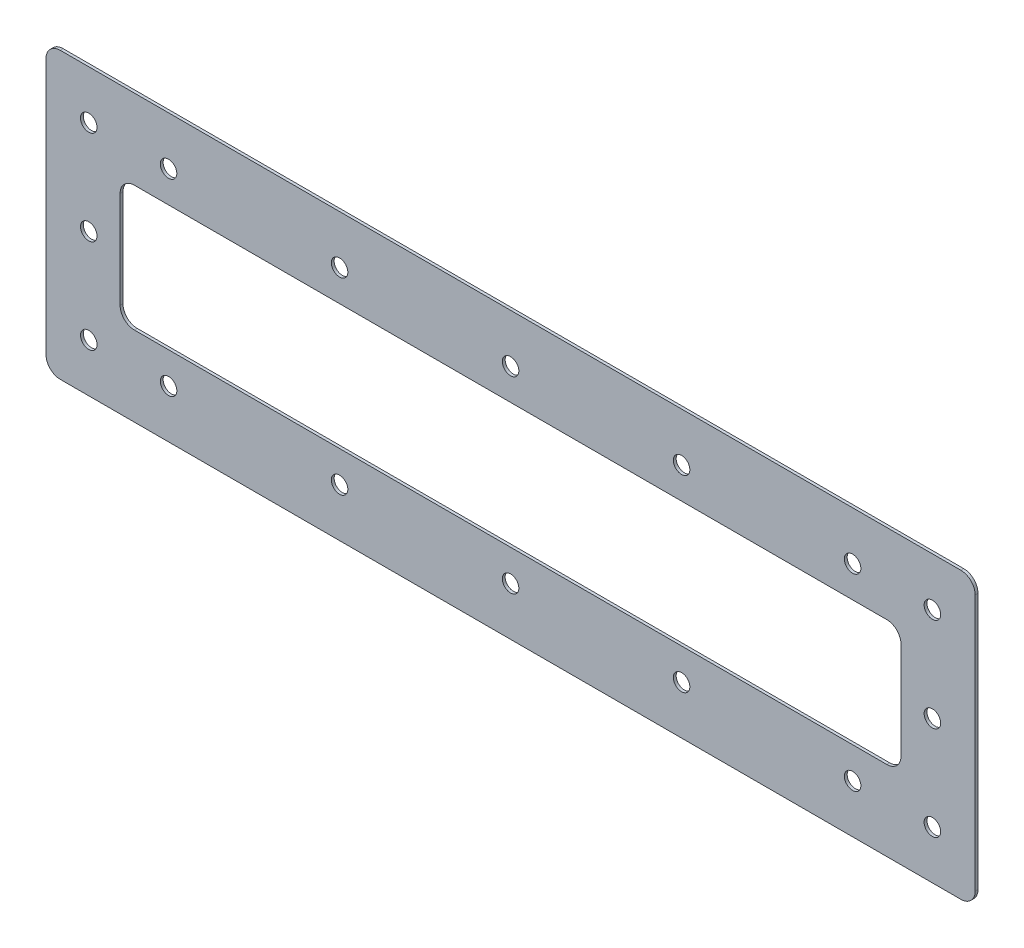
ISO-10303-21;
HEADER;
FILE_DESCRIPTION(('STEP AP214'),'2;1');
FILE_NAME('part.step','',(''),(''),'','','');
FILE_SCHEMA(('AUTOMOTIVE_DESIGN { 1 0 10303 214 1 1 1 1 }'));
ENDSEC;
DATA;
#1=APPLICATION_CONTEXT('core data for automotive mechanical design processes');
#2=APPLICATION_PROTOCOL_DEFINITION('international standard','automotive_design',2000,#1);
#3=PRODUCT_CONTEXT('',#1,'mechanical');
#4=PRODUCT('Part','Part','',(#3));
#5=PRODUCT_RELATED_PRODUCT_CATEGORY('part','',(#4));
#6=PRODUCT_DEFINITION_FORMATION('','',#4);
#7=PRODUCT_DEFINITION_CONTEXT('part definition',#1,'design');
#8=PRODUCT_DEFINITION('design','',#6,#7);
#9=PRODUCT_DEFINITION_SHAPE('','',#8);
#10=(LENGTH_UNIT() NAMED_UNIT(*) SI_UNIT(.MILLI.,.METRE.));
#11=(NAMED_UNIT(*) PLANE_ANGLE_UNIT() SI_UNIT($,.RADIAN.));
#12=(NAMED_UNIT(*) SI_UNIT($,.STERADIAN.) SOLID_ANGLE_UNIT());
#13=UNCERTAINTY_MEASURE_WITH_UNIT(LENGTH_MEASURE(1.E-05),#10,'distance_accuracy_value','');
#14=(GEOMETRIC_REPRESENTATION_CONTEXT(3) GLOBAL_UNCERTAINTY_ASSIGNED_CONTEXT((#13)) GLOBAL_UNIT_ASSIGNED_CONTEXT((#10,
#11,#12)) REPRESENTATION_CONTEXT('',''));
#15=CARTESIAN_POINT('',(0.,0.,0.));
#16=DIRECTION('',(0.,0.,1.));
#17=DIRECTION('',(1.,0.,0.));
#18=AXIS2_PLACEMENT_3D('',#15,#16,#17);
#19=CARTESIAN_POINT('',(0.,0.,1.));
#20=DIRECTION('',(0.,0.,-1.));
#21=DIRECTION('',(-1.,0.,0.));
#22=AXIS2_PLACEMENT_3D('',#19,#20,#21);
#23=PLANE('',#22);
#24=CARTESIAN_POINT('',(0.,33.,1.));
#25=DIRECTION('',(0.,0.,-1.));
#26=DIRECTION('',(-1.,0.,0.));
#27=AXIS2_PLACEMENT_3D('',#24,#25,#26);
#28=CIRCLE('',#27,2.9);
#29=CARTESIAN_POINT('',(-2.9,33.,1.));
#30=VERTEX_POINT('',#29);
#31=EDGE_CURVE('E794',#30,#30,#28,.T.);
#32=ORIENTED_EDGE('',*,*,#31,.T.);
#33=EDGE_LOOP('',(#32));
#34=FACE_BOUND('',#33,.T.);
#35=CARTESIAN_POINT('',(-60.,33.,1.));
#36=DIRECTION('',(0.,0.,-1.));
#37=DIRECTION('',(-1.,0.,0.));
#38=AXIS2_PLACEMENT_3D('',#35,#36,#37);
#39=CIRCLE('',#38,2.9);
#40=CARTESIAN_POINT('',(-62.9,33.,1.));
#41=VERTEX_POINT('',#40);
#42=EDGE_CURVE('E788',#41,#41,#39,.T.);
#43=ORIENTED_EDGE('',*,*,#42,.T.);
#44=EDGE_LOOP('',(#43));
#45=FACE_BOUND('',#44,.T.);
#46=CARTESIAN_POINT('',(-120.,33.,1.));
#47=DIRECTION('',(0.,0.,-1.));
#48=DIRECTION('',(-1.,0.,0.));
#49=AXIS2_PLACEMENT_3D('',#46,#47,#48);
#50=CIRCLE('',#49,2.9);
#51=CARTESIAN_POINT('',(-122.9,33.,1.));
#52=VERTEX_POINT('',#51);
#53=EDGE_CURVE('E782',#52,#52,#50,.T.);
#54=ORIENTED_EDGE('',*,*,#53,.T.);
#55=EDGE_LOOP('',(#54));
#56=FACE_BOUND('',#55,.T.);
#57=CARTESIAN_POINT('',(-148.,33.,1.));
#58=DIRECTION('',(0.,0.,-1.));
#59=DIRECTION('',(-1.,0.,0.));
#60=AXIS2_PLACEMENT_3D('',#57,#58,#59);
#61=CIRCLE('',#60,2.89999999999999);
#62=CARTESIAN_POINT('',(-150.9,33.,1.));
#63=VERTEX_POINT('',#62);
#64=EDGE_CURVE('E776',#63,#63,#61,.T.);
#65=ORIENTED_EDGE('',*,*,#64,.T.);
#66=EDGE_LOOP('',(#65));
#67=FACE_BOUND('',#66,.T.);
#68=CARTESIAN_POINT('',(-148.,0.,1.));
#69=DIRECTION('',(0.,0.,-1.));
#70=DIRECTION('',(-1.,0.,0.));
#71=AXIS2_PLACEMENT_3D('',#68,#69,#70);
#72=CIRCLE('',#71,2.89999999999999);
#73=CARTESIAN_POINT('',(-150.9,0.,1.));
#74=VERTEX_POINT('',#73);
#75=EDGE_CURVE('E770',#74,#74,#72,.T.);
#76=ORIENTED_EDGE('',*,*,#75,.T.);
#77=EDGE_LOOP('',(#76));
#78=FACE_BOUND('',#77,.T.);
#79=CARTESIAN_POINT('',(-148.,-33.,1.));
#80=DIRECTION('',(0.,0.,-1.));
#81=DIRECTION('',(-1.,0.,0.));
#82=AXIS2_PLACEMENT_3D('',#79,#80,#81);
#83=CIRCLE('',#82,2.89999999999999);
#84=CARTESIAN_POINT('',(-150.9,-33.,1.));
#85=VERTEX_POINT('',#84);
#86=EDGE_CURVE('E764',#85,#85,#83,.T.);
#87=ORIENTED_EDGE('',*,*,#86,.T.);
#88=EDGE_LOOP('',(#87));
#89=FACE_BOUND('',#88,.T.);
#90=CARTESIAN_POINT('',(-120.,-33.,1.));
#91=DIRECTION('',(0.,0.,-1.));
#92=DIRECTION('',(-1.,0.,0.));
#93=AXIS2_PLACEMENT_3D('',#90,#91,#92);
#94=CIRCLE('',#93,2.9);
#95=CARTESIAN_POINT('',(-122.9,-33.,1.));
#96=VERTEX_POINT('',#95);
#97=EDGE_CURVE('E758',#96,#96,#94,.T.);
#98=ORIENTED_EDGE('',*,*,#97,.T.);
#99=EDGE_LOOP('',(#98));
#100=FACE_BOUND('',#99,.T.);
#101=CARTESIAN_POINT('',(-60.,-33.,1.));
#102=DIRECTION('',(0.,0.,-1.));
#103=DIRECTION('',(-1.,0.,0.));
#104=AXIS2_PLACEMENT_3D('',#101,#102,#103);
#105=CIRCLE('',#104,2.9);
#106=CARTESIAN_POINT('',(-62.9,-33.,1.));
#107=VERTEX_POINT('',#106);
#108=EDGE_CURVE('E752',#107,#107,#105,.T.);
#109=ORIENTED_EDGE('',*,*,#108,.T.);
#110=EDGE_LOOP('',(#109));
#111=FACE_BOUND('',#110,.T.);
#112=CARTESIAN_POINT('',(0.,-33.,1.));
#113=DIRECTION('',(0.,0.,-1.));
#114=DIRECTION('',(-1.,0.,0.));
#115=AXIS2_PLACEMENT_3D('',#112,#113,#114);
#116=CIRCLE('',#115,2.9);
#117=CARTESIAN_POINT('',(-2.9,-33.,1.));
#118=VERTEX_POINT('',#117);
#119=EDGE_CURVE('E746',#118,#118,#116,.T.);
#120=ORIENTED_EDGE('',*,*,#119,.T.);
#121=EDGE_LOOP('',(#120));
#122=FACE_BOUND('',#121,.T.);
#123=CARTESIAN_POINT('',(60.,33.,1.));
#124=DIRECTION('',(0.,0.,-1.));
#125=DIRECTION('',(-1.,0.,0.));
#126=AXIS2_PLACEMENT_3D('',#123,#124,#125);
#127=CIRCLE('',#126,2.9);
#128=CARTESIAN_POINT('',(57.1,33.,1.));
#129=VERTEX_POINT('',#128);
#130=EDGE_CURVE('E740',#129,#129,#127,.T.);
#131=ORIENTED_EDGE('',*,*,#130,.T.);
#132=EDGE_LOOP('',(#131));
#133=FACE_BOUND('',#132,.T.);
#134=CARTESIAN_POINT('',(60.,-33.,1.));
#135=DIRECTION('',(0.,0.,-1.));
#136=DIRECTION('',(-1.,0.,0.));
#137=AXIS2_PLACEMENT_3D('',#134,#135,#136);
#138=CIRCLE('',#137,2.9);
#139=CARTESIAN_POINT('',(57.1,-33.,1.));
#140=VERTEX_POINT('',#139);
#141=EDGE_CURVE('E734',#140,#140,#138,.T.);
#142=ORIENTED_EDGE('',*,*,#141,.T.);
#143=EDGE_LOOP('',(#142));
#144=FACE_BOUND('',#143,.T.);
#145=CARTESIAN_POINT('',(120.,-33.,1.));
#146=DIRECTION('',(0.,0.,-1.));
#147=DIRECTION('',(-1.,0.,0.));
#148=AXIS2_PLACEMENT_3D('',#145,#146,#147);
#149=CIRCLE('',#148,2.9);
#150=CARTESIAN_POINT('',(117.1,-33.,1.));
#151=VERTEX_POINT('',#150);
#152=EDGE_CURVE('E728',#151,#151,#149,.T.);
#153=ORIENTED_EDGE('',*,*,#152,.T.);
#154=EDGE_LOOP('',(#153));
#155=FACE_BOUND('',#154,.T.);
#156=CARTESIAN_POINT('',(148.,-33.,1.));
#157=DIRECTION('',(0.,0.,-1.));
#158=DIRECTION('',(-1.,0.,0.));
#159=AXIS2_PLACEMENT_3D('',#156,#157,#158);
#160=CIRCLE('',#159,2.89999999999999);
#161=CARTESIAN_POINT('',(145.1,-33.,1.));
#162=VERTEX_POINT('',#161);
#163=EDGE_CURVE('E722',#162,#162,#160,.T.);
#164=ORIENTED_EDGE('',*,*,#163,.T.);
#165=EDGE_LOOP('',(#164));
#166=FACE_BOUND('',#165,.T.);
#167=CARTESIAN_POINT('',(148.,0.,1.));
#168=DIRECTION('',(0.,0.,-1.));
#169=DIRECTION('',(-1.,0.,0.));
#170=AXIS2_PLACEMENT_3D('',#167,#168,#169);
#171=CIRCLE('',#170,2.89999999999999);
#172=CARTESIAN_POINT('',(145.1,0.,1.));
#173=VERTEX_POINT('',#172);
#174=EDGE_CURVE('E716',#173,#173,#171,.T.);
#175=ORIENTED_EDGE('',*,*,#174,.T.);
#176=EDGE_LOOP('',(#175));
#177=FACE_BOUND('',#176,.T.);
#178=CARTESIAN_POINT('',(148.,33.,1.));
#179=DIRECTION('',(0.,0.,-1.));
#180=DIRECTION('',(-1.,0.,0.));
#181=AXIS2_PLACEMENT_3D('',#178,#179,#180);
#182=CIRCLE('',#181,2.89999999999999);
#183=CARTESIAN_POINT('',(145.1,33.,1.));
#184=VERTEX_POINT('',#183);
#185=EDGE_CURVE('E710',#184,#184,#182,.T.);
#186=ORIENTED_EDGE('',*,*,#185,.T.);
#187=EDGE_LOOP('',(#186));
#188=FACE_BOUND('',#187,.T.);
#189=CARTESIAN_POINT('',(120.,33.,1.));
#190=DIRECTION('',(0.,0.,-1.));
#191=DIRECTION('',(-1.,0.,0.));
#192=AXIS2_PLACEMENT_3D('',#189,#190,#191);
#193=CIRCLE('',#192,2.9);
#194=CARTESIAN_POINT('',(117.1,33.,1.));
#195=VERTEX_POINT('',#194);
#196=EDGE_CURVE('E170',#195,#195,#193,.T.);
#197=ORIENTED_EDGE('',*,*,#196,.T.);
#198=EDGE_LOOP('',(#197));
#199=FACE_BOUND('',#198,.T.);
#200=DIRECTION('',(1.,0.,0.));
#201=VECTOR('',#200,1.);
#202=CARTESIAN_POINT('',(-163.,-50.,1.));
#203=LINE('',#202,#201);
#204=CARTESIAN_POINT('',(-158.,-50.,1.));
#205=VERTEX_POINT('',#204);
#206=CARTESIAN_POINT('',(158.,-50.,1.));
#207=VERTEX_POINT('',#206);
#208=EDGE_CURVE('E174',#205,#207,#203,.T.);
#209=ORIENTED_EDGE('',*,*,#208,.T.);
#210=CARTESIAN_POINT('',(158.,-45.,1.));
#211=DIRECTION('',(0.,0.,-1.));
#212=DIRECTION('',(-1.,0.,0.));
#213=AXIS2_PLACEMENT_3D('',#210,#211,#212);
#214=CIRCLE('',#213,5.);
#215=CARTESIAN_POINT('',(163.,-45.,1.));
#216=VERTEX_POINT('',#215);
#217=EDGE_CURVE('E221',#207,#216,#214,.F.);
#218=ORIENTED_EDGE('',*,*,#217,.T.);
#219=DIRECTION('',(0.,1.,0.));
#220=VECTOR('',#219,1.);
#221=CARTESIAN_POINT('',(163.,-50.,1.));
#222=LINE('',#221,#220);
#223=CARTESIAN_POINT('',(163.,45.,1.));
#224=VERTEX_POINT('',#223);
#225=EDGE_CURVE('E270',#216,#224,#222,.T.);
#226=ORIENTED_EDGE('',*,*,#225,.T.);
#227=CARTESIAN_POINT('',(158.,45.,1.));
#228=DIRECTION('',(0.,0.,-1.));
#229=DIRECTION('',(-1.,0.,0.));
#230=AXIS2_PLACEMENT_3D('',#227,#228,#229);
#231=CIRCLE('',#230,5.);
#232=CARTESIAN_POINT('',(158.,50.,1.));
#233=VERTEX_POINT('',#232);
#234=EDGE_CURVE('E217',#224,#233,#231,.F.);
#235=ORIENTED_EDGE('',*,*,#234,.T.);
#236=DIRECTION('',(-1.,0.,0.));
#237=VECTOR('',#236,1.);
#238=CARTESIAN_POINT('',(-163.,50.,1.));
#239=LINE('',#238,#237);
#240=CARTESIAN_POINT('',(-158.,50.,1.));
#241=VERTEX_POINT('',#240);
#242=EDGE_CURVE('E273',#233,#241,#239,.T.);
#243=ORIENTED_EDGE('',*,*,#242,.T.);
#244=CARTESIAN_POINT('',(-158.,45.,1.));
#245=DIRECTION('',(0.,0.,-1.));
#246=DIRECTION('',(-1.,0.,0.));
#247=AXIS2_PLACEMENT_3D('',#244,#245,#246);
#248=CIRCLE('',#247,5.);
#249=CARTESIAN_POINT('',(-163.,45.,1.));
#250=VERTEX_POINT('',#249);
#251=EDGE_CURVE('E58',#241,#250,#248,.F.);
#252=ORIENTED_EDGE('',*,*,#251,.T.);
#253=DIRECTION('',(0.,-1.,0.));
#254=VECTOR('',#253,1.);
#255=CARTESIAN_POINT('',(-163.,-50.,1.));
#256=LINE('',#255,#254);
#257=CARTESIAN_POINT('',(-163.,-45.,1.));
#258=VERTEX_POINT('',#257);
#259=EDGE_CURVE('E179',#250,#258,#256,.T.);
#260=ORIENTED_EDGE('',*,*,#259,.T.);
#261=CARTESIAN_POINT('',(-158.,-45.,1.));
#262=DIRECTION('',(0.,0.,-1.));
#263=DIRECTION('',(-1.,0.,0.));
#264=AXIS2_PLACEMENT_3D('',#261,#262,#263);
#265=CIRCLE('',#264,5.);
#266=EDGE_CURVE('E219',#258,#205,#265,.F.);
#267=ORIENTED_EDGE('',*,*,#266,.T.);
#268=EDGE_LOOP('',(#209,#218,#226,#235,#243,#252,#260,#267));
#269=FACE_BOUND('',#268,.T.);
#270=DIRECTION('',(0.,-1.,0.));
#271=VECTOR('',#270,1.);
#272=CARTESIAN_POINT('',(-137.,-22.,1.));
#273=LINE('',#272,#271);
#274=CARTESIAN_POINT('',(-137.,16.9999999999999,1.));
#275=VERTEX_POINT('',#274);
#276=CARTESIAN_POINT('',(-137.,-17.,1.));
#277=VERTEX_POINT('',#276);
#278=EDGE_CURVE('E264',#275,#277,#273,.T.);
#279=ORIENTED_EDGE('',*,*,#278,.F.);
#280=CARTESIAN_POINT('',(-132.,17.,1.));
#281=DIRECTION('',(0.,0.,-1.));
#282=DIRECTION('',(-1.,0.,0.));
#283=AXIS2_PLACEMENT_3D('',#280,#281,#282);
#284=CIRCLE('',#283,5.);
#285=CARTESIAN_POINT('',(-132.,22.,1.));
#286=VERTEX_POINT('',#285);
#287=EDGE_CURVE('E11',#275,#286,#284,.T.);
#288=ORIENTED_EDGE('',*,*,#287,.T.);
#289=DIRECTION('',(-1.,0.,0.));
#290=VECTOR('',#289,1.);
#291=CARTESIAN_POINT('',(137.,22.,1.));
#292=LINE('',#291,#290);
#293=CARTESIAN_POINT('',(132.,22.,1.));
#294=VERTEX_POINT('',#293);
#295=EDGE_CURVE('E250',#294,#286,#292,.T.);
#296=ORIENTED_EDGE('',*,*,#295,.F.);
#297=CARTESIAN_POINT('',(132.,17.,1.));
#298=DIRECTION('',(0.,0.,-1.));
#299=DIRECTION('',(-1.,0.,0.));
#300=AXIS2_PLACEMENT_3D('',#297,#298,#299);
#301=CIRCLE('',#300,5.);
#302=CARTESIAN_POINT('',(137.,17.,1.));
#303=VERTEX_POINT('',#302);
#304=EDGE_CURVE('E160',#294,#303,#301,.T.);
#305=ORIENTED_EDGE('',*,*,#304,.T.);
#306=DIRECTION('',(0.,1.,0.));
#307=VECTOR('',#306,1.);
#308=CARTESIAN_POINT('',(137.,-22.,1.));
#309=LINE('',#308,#307);
#310=CARTESIAN_POINT('',(137.,-17.,1.));
#311=VERTEX_POINT('',#310);
#312=EDGE_CURVE('E247',#311,#303,#309,.T.);
#313=ORIENTED_EDGE('',*,*,#312,.F.);
#314=CARTESIAN_POINT('',(132.,-17.,1.));
#315=DIRECTION('',(0.,0.,-1.));
#316=DIRECTION('',(-1.,0.,0.));
#317=AXIS2_PLACEMENT_3D('',#314,#315,#316);
#318=CIRCLE('',#317,5.);
#319=CARTESIAN_POINT('',(132.,-22.,1.));
#320=VERTEX_POINT('',#319);
#321=EDGE_CURVE('E238',#311,#320,#318,.T.);
#322=ORIENTED_EDGE('',*,*,#321,.T.);
#323=DIRECTION('',(1.,0.,0.));
#324=VECTOR('',#323,1.);
#325=CARTESIAN_POINT('',(137.,-22.,1.));
#326=LINE('',#325,#324);
#327=CARTESIAN_POINT('',(-132.,-22.,1.));
#328=VERTEX_POINT('',#327);
#329=EDGE_CURVE('E258',#328,#320,#326,.T.);
#330=ORIENTED_EDGE('',*,*,#329,.F.);
#331=CARTESIAN_POINT('',(-132.,-17.,1.));
#332=DIRECTION('',(0.,0.,-1.));
#333=DIRECTION('',(-1.,0.,0.));
#334=AXIS2_PLACEMENT_3D('',#331,#332,#333);
#335=CIRCLE('',#334,5.);
#336=EDGE_CURVE('E234',#328,#277,#335,.T.);
#337=ORIENTED_EDGE('',*,*,#336,.T.);
#338=EDGE_LOOP('',(#279,#288,#296,#305,#313,#322,#330,#337));
#339=FACE_BOUND('',#338,.T.);
#340=ADVANCED_FACE('F36',(#34,#45,#56,#67,#78,#89,#100,#111,#122,#133,#144,#155,#166,#177,#188,
#199,#269,#339),#23,.F.);
#341=CARTESIAN_POINT('',(0.,0.,0.));
#342=DIRECTION('',(0.,0.,-1.));
#343=DIRECTION('',(-1.,0.,0.));
#344=AXIS2_PLACEMENT_3D('',#341,#342,#343);
#345=PLANE('',#344);
#346=CARTESIAN_POINT('',(0.,33.,0.));
#347=DIRECTION('',(0.,0.,-1.));
#348=DIRECTION('',(-1.,0.,0.));
#349=AXIS2_PLACEMENT_3D('',#346,#347,#348);
#350=CIRCLE('',#349,2.89999999999999);
#351=CARTESIAN_POINT('',(-2.89999999999999,33.,0.));
#352=VERTEX_POINT('',#351);
#353=EDGE_CURVE('E796',#352,#352,#350,.T.);
#354=ORIENTED_EDGE('',*,*,#353,.F.);
#355=EDGE_LOOP('',(#354));
#356=FACE_BOUND('',#355,.T.);
#357=CARTESIAN_POINT('',(-60.,33.,0.));
#358=DIRECTION('',(0.,0.,-1.));
#359=DIRECTION('',(-1.,0.,0.));
#360=AXIS2_PLACEMENT_3D('',#357,#358,#359);
#361=CIRCLE('',#360,2.89999999999999);
#362=CARTESIAN_POINT('',(-62.9,33.,0.));
#363=VERTEX_POINT('',#362);
#364=EDGE_CURVE('E791',#363,#363,#361,.T.);
#365=ORIENTED_EDGE('',*,*,#364,.F.);
#366=EDGE_LOOP('',(#365));
#367=FACE_BOUND('',#366,.T.);
#368=CARTESIAN_POINT('',(-120.,33.,0.));
#369=DIRECTION('',(0.,0.,-1.));
#370=DIRECTION('',(-1.,0.,0.));
#371=AXIS2_PLACEMENT_3D('',#368,#369,#370);
#372=CIRCLE('',#371,2.89999999999999);
#373=CARTESIAN_POINT('',(-122.9,33.,0.));
#374=VERTEX_POINT('',#373);
#375=EDGE_CURVE('E785',#374,#374,#372,.T.);
#376=ORIENTED_EDGE('',*,*,#375,.F.);
#377=EDGE_LOOP('',(#376));
#378=FACE_BOUND('',#377,.T.);
#379=CARTESIAN_POINT('',(-148.,33.,0.));
#380=DIRECTION('',(0.,0.,-1.));
#381=DIRECTION('',(-1.,0.,0.));
#382=AXIS2_PLACEMENT_3D('',#379,#380,#381);
#383=CIRCLE('',#382,2.89999999999999);
#384=CARTESIAN_POINT('',(-150.9,33.,0.));
#385=VERTEX_POINT('',#384);
#386=EDGE_CURVE('E779',#385,#385,#383,.T.);
#387=ORIENTED_EDGE('',*,*,#386,.F.);
#388=EDGE_LOOP('',(#387));
#389=FACE_BOUND('',#388,.T.);
#390=CARTESIAN_POINT('',(-148.,0.,0.));
#391=DIRECTION('',(0.,0.,-1.));
#392=DIRECTION('',(-1.,0.,0.));
#393=AXIS2_PLACEMENT_3D('',#390,#391,#392);
#394=CIRCLE('',#393,2.89999999999999);
#395=CARTESIAN_POINT('',(-150.9,0.,0.));
#396=VERTEX_POINT('',#395);
#397=EDGE_CURVE('E773',#396,#396,#394,.T.);
#398=ORIENTED_EDGE('',*,*,#397,.F.);
#399=EDGE_LOOP('',(#398));
#400=FACE_BOUND('',#399,.T.);
#401=CARTESIAN_POINT('',(-148.,-33.,0.));
#402=DIRECTION('',(0.,0.,-1.));
#403=DIRECTION('',(-1.,0.,0.));
#404=AXIS2_PLACEMENT_3D('',#401,#402,#403);
#405=CIRCLE('',#404,2.89999999999999);
#406=CARTESIAN_POINT('',(-150.9,-33.,0.));
#407=VERTEX_POINT('',#406);
#408=EDGE_CURVE('E767',#407,#407,#405,.T.);
#409=ORIENTED_EDGE('',*,*,#408,.F.);
#410=EDGE_LOOP('',(#409));
#411=FACE_BOUND('',#410,.T.);
#412=CARTESIAN_POINT('',(-120.,-33.,0.));
#413=DIRECTION('',(0.,0.,-1.));
#414=DIRECTION('',(-1.,0.,0.));
#415=AXIS2_PLACEMENT_3D('',#412,#413,#414);
#416=CIRCLE('',#415,2.89999999999999);
#417=CARTESIAN_POINT('',(-122.9,-33.,0.));
#418=VERTEX_POINT('',#417);
#419=EDGE_CURVE('E761',#418,#418,#416,.T.);
#420=ORIENTED_EDGE('',*,*,#419,.F.);
#421=EDGE_LOOP('',(#420));
#422=FACE_BOUND('',#421,.T.);
#423=CARTESIAN_POINT('',(-60.,-33.,0.));
#424=DIRECTION('',(0.,0.,-1.));
#425=DIRECTION('',(-1.,0.,0.));
#426=AXIS2_PLACEMENT_3D('',#423,#424,#425);
#427=CIRCLE('',#426,2.89999999999999);
#428=CARTESIAN_POINT('',(-62.9,-33.,0.));
#429=VERTEX_POINT('',#428);
#430=EDGE_CURVE('E755',#429,#429,#427,.T.);
#431=ORIENTED_EDGE('',*,*,#430,.F.);
#432=EDGE_LOOP('',(#431));
#433=FACE_BOUND('',#432,.T.);
#434=CARTESIAN_POINT('',(0.,-33.,0.));
#435=DIRECTION('',(0.,0.,-1.));
#436=DIRECTION('',(-1.,0.,0.));
#437=AXIS2_PLACEMENT_3D('',#434,#435,#436);
#438=CIRCLE('',#437,2.89999999999999);
#439=CARTESIAN_POINT('',(-2.89999999999999,-33.,0.));
#440=VERTEX_POINT('',#439);
#441=EDGE_CURVE('E749',#440,#440,#438,.T.);
#442=ORIENTED_EDGE('',*,*,#441,.F.);
#443=EDGE_LOOP('',(#442));
#444=FACE_BOUND('',#443,.T.);
#445=CARTESIAN_POINT('',(60.,33.,0.));
#446=DIRECTION('',(0.,0.,-1.));
#447=DIRECTION('',(-1.,0.,0.));
#448=AXIS2_PLACEMENT_3D('',#445,#446,#447);
#449=CIRCLE('',#448,2.89999999999999);
#450=CARTESIAN_POINT('',(57.1,33.,0.));
#451=VERTEX_POINT('',#450);
#452=EDGE_CURVE('E743',#451,#451,#449,.T.);
#453=ORIENTED_EDGE('',*,*,#452,.F.);
#454=EDGE_LOOP('',(#453));
#455=FACE_BOUND('',#454,.T.);
#456=CARTESIAN_POINT('',(60.,-33.,0.));
#457=DIRECTION('',(0.,0.,-1.));
#458=DIRECTION('',(-1.,0.,0.));
#459=AXIS2_PLACEMENT_3D('',#456,#457,#458);
#460=CIRCLE('',#459,2.89999999999999);
#461=CARTESIAN_POINT('',(57.1,-33.,0.));
#462=VERTEX_POINT('',#461);
#463=EDGE_CURVE('E737',#462,#462,#460,.T.);
#464=ORIENTED_EDGE('',*,*,#463,.F.);
#465=EDGE_LOOP('',(#464));
#466=FACE_BOUND('',#465,.T.);
#467=CARTESIAN_POINT('',(120.,-33.,0.));
#468=DIRECTION('',(0.,0.,-1.));
#469=DIRECTION('',(-1.,0.,0.));
#470=AXIS2_PLACEMENT_3D('',#467,#468,#469);
#471=CIRCLE('',#470,2.89999999999999);
#472=CARTESIAN_POINT('',(117.1,-33.,0.));
#473=VERTEX_POINT('',#472);
#474=EDGE_CURVE('E731',#473,#473,#471,.T.);
#475=ORIENTED_EDGE('',*,*,#474,.F.);
#476=EDGE_LOOP('',(#475));
#477=FACE_BOUND('',#476,.T.);
#478=CARTESIAN_POINT('',(148.,-33.,0.));
#479=DIRECTION('',(0.,0.,-1.));
#480=DIRECTION('',(-1.,0.,0.));
#481=AXIS2_PLACEMENT_3D('',#478,#479,#480);
#482=CIRCLE('',#481,2.89999999999999);
#483=CARTESIAN_POINT('',(145.1,-33.,0.));
#484=VERTEX_POINT('',#483);
#485=EDGE_CURVE('E725',#484,#484,#482,.T.);
#486=ORIENTED_EDGE('',*,*,#485,.F.);
#487=EDGE_LOOP('',(#486));
#488=FACE_BOUND('',#487,.T.);
#489=CARTESIAN_POINT('',(148.,0.,0.));
#490=DIRECTION('',(0.,0.,-1.));
#491=DIRECTION('',(-1.,0.,0.));
#492=AXIS2_PLACEMENT_3D('',#489,#490,#491);
#493=CIRCLE('',#492,2.89999999999999);
#494=CARTESIAN_POINT('',(145.1,0.,0.));
#495=VERTEX_POINT('',#494);
#496=EDGE_CURVE('E719',#495,#495,#493,.T.);
#497=ORIENTED_EDGE('',*,*,#496,.F.);
#498=EDGE_LOOP('',(#497));
#499=FACE_BOUND('',#498,.T.);
#500=CARTESIAN_POINT('',(148.,33.,0.));
#501=DIRECTION('',(0.,0.,-1.));
#502=DIRECTION('',(-1.,0.,0.));
#503=AXIS2_PLACEMENT_3D('',#500,#501,#502);
#504=CIRCLE('',#503,2.89999999999999);
#505=CARTESIAN_POINT('',(145.1,33.,0.));
#506=VERTEX_POINT('',#505);
#507=EDGE_CURVE('E713',#506,#506,#504,.T.);
#508=ORIENTED_EDGE('',*,*,#507,.F.);
#509=EDGE_LOOP('',(#508));
#510=FACE_BOUND('',#509,.T.);
#511=CARTESIAN_POINT('',(120.,33.,0.));
#512=DIRECTION('',(0.,0.,-1.));
#513=DIRECTION('',(-1.,0.,0.));
#514=AXIS2_PLACEMENT_3D('',#511,#512,#513);
#515=CIRCLE('',#514,2.89999999999999);
#516=CARTESIAN_POINT('',(117.1,33.,0.));
#517=VERTEX_POINT('',#516);
#518=EDGE_CURVE('E707',#517,#517,#515,.T.);
#519=ORIENTED_EDGE('',*,*,#518,.F.);
#520=EDGE_LOOP('',(#519));
#521=FACE_BOUND('',#520,.T.);
#522=DIRECTION('',(0.,1.,0.));
#523=VECTOR('',#522,1.);
#524=CARTESIAN_POINT('',(163.,-50.,0.));
#525=LINE('',#524,#523);
#526=CARTESIAN_POINT('',(163.,-45.,0.));
#527=VERTEX_POINT('',#526);
#528=CARTESIAN_POINT('',(163.,45.,0.));
#529=VERTEX_POINT('',#528);
#530=EDGE_CURVE('E276',#527,#529,#525,.T.);
#531=ORIENTED_EDGE('',*,*,#530,.F.);
#532=CARTESIAN_POINT('',(158.,-45.,0.));
#533=DIRECTION('',(0.,0.,-1.));
#534=DIRECTION('',(-1.,0.,0.));
#535=AXIS2_PLACEMENT_3D('',#532,#533,#534);
#536=CIRCLE('',#535,5.);
#537=CARTESIAN_POINT('',(158.,-50.,0.));
#538=VERTEX_POINT('',#537);
#539=EDGE_CURVE('E209',#527,#538,#536,.T.);
#540=ORIENTED_EDGE('',*,*,#539,.T.);
#541=DIRECTION('',(1.,0.,0.));
#542=VECTOR('',#541,1.);
#543=CARTESIAN_POINT('',(-163.,-50.,0.));
#544=LINE('',#543,#542);
#545=CARTESIAN_POINT('',(-158.,-50.,0.));
#546=VERTEX_POINT('',#545);
#547=EDGE_CURVE('E182',#546,#538,#544,.T.);
#548=ORIENTED_EDGE('',*,*,#547,.F.);
#549=CARTESIAN_POINT('',(-158.,-45.,0.));
#550=DIRECTION('',(0.,0.,-1.));
#551=DIRECTION('',(-1.,0.,0.));
#552=AXIS2_PLACEMENT_3D('',#549,#550,#551);
#553=CIRCLE('',#552,5.);
#554=CARTESIAN_POINT('',(-163.,-45.,0.));
#555=VERTEX_POINT('',#554);
#556=EDGE_CURVE('E207',#546,#555,#553,.T.);
#557=ORIENTED_EDGE('',*,*,#556,.T.);
#558=DIRECTION('',(0.,-1.,0.));
#559=VECTOR('',#558,1.);
#560=CARTESIAN_POINT('',(-163.,-50.,0.));
#561=LINE('',#560,#559);
#562=CARTESIAN_POINT('',(-163.,45.,0.));
#563=VERTEX_POINT('',#562);
#564=EDGE_CURVE('E281',#563,#555,#561,.T.);
#565=ORIENTED_EDGE('',*,*,#564,.F.);
#566=CARTESIAN_POINT('',(-158.,45.,0.));
#567=DIRECTION('',(0.,0.,-1.));
#568=DIRECTION('',(-1.,0.,0.));
#569=AXIS2_PLACEMENT_3D('',#566,#567,#568);
#570=CIRCLE('',#569,5.);
#571=CARTESIAN_POINT('',(-158.,50.,0.));
#572=VERTEX_POINT('',#571);
#573=EDGE_CURVE('E203',#563,#572,#570,.T.);
#574=ORIENTED_EDGE('',*,*,#573,.T.);
#575=DIRECTION('',(-1.,0.,0.));
#576=VECTOR('',#575,1.);
#577=CARTESIAN_POINT('',(-163.,50.,0.));
#578=LINE('',#577,#576);
#579=CARTESIAN_POINT('',(158.,50.,0.));
#580=VERTEX_POINT('',#579);
#581=EDGE_CURVE('E279',#580,#572,#578,.T.);
#582=ORIENTED_EDGE('',*,*,#581,.F.);
#583=CARTESIAN_POINT('',(158.,45.,0.));
#584=DIRECTION('',(0.,0.,-1.));
#585=DIRECTION('',(-1.,0.,0.));
#586=AXIS2_PLACEMENT_3D('',#583,#584,#585);
#587=CIRCLE('',#586,5.);
#588=EDGE_CURVE('E205',#580,#529,#587,.T.);
#589=ORIENTED_EDGE('',*,*,#588,.T.);
#590=EDGE_LOOP('',(#531,#540,#548,#557,#565,#574,#582,#589));
#591=FACE_BOUND('',#590,.T.);
#592=DIRECTION('',(0.,1.,0.));
#593=VECTOR('',#592,1.);
#594=CARTESIAN_POINT('',(137.,-22.,0.));
#595=LINE('',#594,#593);
#596=CARTESIAN_POINT('',(137.,-17.,0.));
#597=VERTEX_POINT('',#596);
#598=CARTESIAN_POINT('',(137.,17.,0.));
#599=VERTEX_POINT('',#598);
#600=EDGE_CURVE('E261',#597,#599,#595,.T.);
#601=ORIENTED_EDGE('',*,*,#600,.T.);
#602=CARTESIAN_POINT('',(132.,17.,0.));
#603=DIRECTION('',(0.,0.,-1.));
#604=DIRECTION('',(-1.,0.,0.));
#605=AXIS2_PLACEMENT_3D('',#602,#603,#604);
#606=CIRCLE('',#605,5.);
#607=CARTESIAN_POINT('',(132.,22.,0.));
#608=VERTEX_POINT('',#607);
#609=EDGE_CURVE('E240',#599,#608,#606,.F.);
#610=ORIENTED_EDGE('',*,*,#609,.T.);
#611=DIRECTION('',(-1.,0.,0.));
#612=VECTOR('',#611,1.);
#613=CARTESIAN_POINT('',(137.,22.,0.));
#614=LINE('',#613,#612);
#615=CARTESIAN_POINT('',(-132.,22.,0.));
#616=VERTEX_POINT('',#615);
#617=EDGE_CURVE('E155',#608,#616,#614,.T.);
#618=ORIENTED_EDGE('',*,*,#617,.T.);
#619=CARTESIAN_POINT('',(-132.,17.,0.));
#620=DIRECTION('',(0.,0.,-1.));
#621=DIRECTION('',(-1.,0.,0.));
#622=AXIS2_PLACEMENT_3D('',#619,#620,#621);
#623=CIRCLE('',#622,5.);
#624=CARTESIAN_POINT('',(-137.,16.9999999999999,0.));
#625=VERTEX_POINT('',#624);
#626=EDGE_CURVE('E44',#616,#625,#623,.F.);
#627=ORIENTED_EDGE('',*,*,#626,.T.);
#628=DIRECTION('',(0.,-1.,0.));
#629=VECTOR('',#628,1.);
#630=CARTESIAN_POINT('',(-137.,-22.,0.));
#631=LINE('',#630,#629);
#632=CARTESIAN_POINT('',(-137.,-17.,0.));
#633=VERTEX_POINT('',#632);
#634=EDGE_CURVE('E153',#625,#633,#631,.T.);
#635=ORIENTED_EDGE('',*,*,#634,.T.);
#636=CARTESIAN_POINT('',(-132.,-17.,0.));
#637=DIRECTION('',(0.,0.,-1.));
#638=DIRECTION('',(-1.,0.,0.));
#639=AXIS2_PLACEMENT_3D('',#636,#637,#638);
#640=CIRCLE('',#639,5.);
#641=CARTESIAN_POINT('',(-132.,-22.,0.));
#642=VERTEX_POINT('',#641);
#643=EDGE_CURVE('E232',#633,#642,#640,.F.);
#644=ORIENTED_EDGE('',*,*,#643,.T.);
#645=DIRECTION('',(1.,0.,0.));
#646=VECTOR('',#645,1.);
#647=CARTESIAN_POINT('',(137.,-22.,0.));
#648=LINE('',#647,#646);
#649=CARTESIAN_POINT('',(132.,-22.,0.));
#650=VERTEX_POINT('',#649);
#651=EDGE_CURVE('E169',#642,#650,#648,.T.);
#652=ORIENTED_EDGE('',*,*,#651,.T.);
#653=CARTESIAN_POINT('',(132.,-17.,0.));
#654=DIRECTION('',(0.,0.,-1.));
#655=DIRECTION('',(-1.,0.,0.));
#656=AXIS2_PLACEMENT_3D('',#653,#654,#655);
#657=CIRCLE('',#656,5.);
#658=EDGE_CURVE('E236',#650,#597,#657,.F.);
#659=ORIENTED_EDGE('',*,*,#658,.T.);
#660=EDGE_LOOP('',(#601,#610,#618,#627,#635,#644,#652,#659));
#661=FACE_BOUND('',#660,.T.);
#662=ADVANCED_FACE('F152',(#356,#367,#378,#389,#400,#411,#422,#433,#444,#455,#466,#477,#488,
#499,#510,#521,#591,#661),#345,.T.);
#663=CARTESIAN_POINT('',(163.,-50.,1.));
#664=DIRECTION('',(-1.,0.,0.));
#665=DIRECTION('',(0.,0.,1.));
#666=AXIS2_PLACEMENT_3D('',#663,#664,#665);
#667=PLANE('',#666);
#668=ORIENTED_EDGE('',*,*,#225,.F.);
#669=DIRECTION('',(0.,0.,-1.));
#670=VECTOR('',#669,1.);
#671=CARTESIAN_POINT('',(163.,-45.,1.));
#672=LINE('',#671,#670);
#673=EDGE_CURVE('E200',#216,#527,#672,.T.);
#674=ORIENTED_EDGE('',*,*,#673,.T.);
#675=ORIENTED_EDGE('',*,*,#530,.T.);
#676=DIRECTION('',(0.,0.,-1.));
#677=VECTOR('',#676,1.);
#678=CARTESIAN_POINT('',(163.,45.,1.));
#679=LINE('',#678,#677);
#680=EDGE_CURVE('E198',#529,#224,#679,.F.);
#681=ORIENTED_EDGE('',*,*,#680,.T.);
#682=EDGE_LOOP('',(#668,#674,#675,#681));
#683=FACE_BOUND('',#682,.T.);
#684=ADVANCED_FACE('F298',(#683),#667,.F.);
#685=CARTESIAN_POINT('',(-163.,50.,1.));
#686=DIRECTION('',(0.,-1.,0.));
#687=DIRECTION('',(0.,0.,-1.));
#688=AXIS2_PLACEMENT_3D('',#685,#686,#687);
#689=PLANE('',#688);
#690=ORIENTED_EDGE('',*,*,#242,.F.);
#691=DIRECTION('',(0.,0.,-1.));
#692=VECTOR('',#691,1.);
#693=CARTESIAN_POINT('',(158.,50.,1.));
#694=LINE('',#693,#692);
#695=EDGE_CURVE('E229',#233,#580,#694,.T.);
#696=ORIENTED_EDGE('',*,*,#695,.T.);
#697=ORIENTED_EDGE('',*,*,#581,.T.);
#698=DIRECTION('',(0.,0.,-1.));
#699=VECTOR('',#698,1.);
#700=CARTESIAN_POINT('',(-158.,50.,1.));
#701=LINE('',#700,#699);
#702=EDGE_CURVE('E227',#572,#241,#701,.F.);
#703=ORIENTED_EDGE('',*,*,#702,.T.);
#704=EDGE_LOOP('',(#690,#696,#697,#703));
#705=FACE_BOUND('',#704,.T.);
#706=ADVANCED_FACE('F306',(#705),#689,.F.);
#707=CARTESIAN_POINT('',(-163.,-50.,1.));
#708=DIRECTION('',(1.,0.,0.));
#709=DIRECTION('',(0.,0.,-1.));
#710=AXIS2_PLACEMENT_3D('',#707,#708,#709);
#711=PLANE('',#710);
#712=ORIENTED_EDGE('',*,*,#564,.T.);
#713=DIRECTION('',(0.,0.,-1.));
#714=VECTOR('',#713,1.);
#715=CARTESIAN_POINT('',(-163.,-45.,1.));
#716=LINE('',#715,#714);
#717=EDGE_CURVE('E51',#555,#258,#716,.F.);
#718=ORIENTED_EDGE('',*,*,#717,.T.);
#719=ORIENTED_EDGE('',*,*,#259,.F.);
#720=DIRECTION('',(0.,0.,-1.));
#721=VECTOR('',#720,1.);
#722=CARTESIAN_POINT('',(-163.,45.,1.));
#723=LINE('',#722,#721);
#724=EDGE_CURVE('E223',#250,#563,#723,.T.);
#725=ORIENTED_EDGE('',*,*,#724,.T.);
#726=EDGE_LOOP('',(#712,#718,#719,#725));
#727=FACE_BOUND('',#726,.T.);
#728=ADVANCED_FACE('F311',(#727),#711,.F.);
#729=CARTESIAN_POINT('',(-163.,-50.,1.));
#730=DIRECTION('',(0.,1.,0.));
#731=DIRECTION('',(0.,0.,1.));
#732=AXIS2_PLACEMENT_3D('',#729,#730,#731);
#733=PLANE('',#732);
#734=ORIENTED_EDGE('',*,*,#547,.T.);
#735=DIRECTION('',(0.,0.,-1.));
#736=VECTOR('',#735,1.);
#737=CARTESIAN_POINT('',(158.,-50.,1.));
#738=LINE('',#737,#736);
#739=EDGE_CURVE('E214',#538,#207,#738,.F.);
#740=ORIENTED_EDGE('',*,*,#739,.T.);
#741=ORIENTED_EDGE('',*,*,#208,.F.);
#742=DIRECTION('',(0.,0.,-1.));
#743=VECTOR('',#742,1.);
#744=CARTESIAN_POINT('',(-158.,-50.,1.));
#745=LINE('',#744,#743);
#746=EDGE_CURVE('E211',#205,#546,#745,.T.);
#747=ORIENTED_EDGE('',*,*,#746,.T.);
#748=EDGE_LOOP('',(#734,#740,#741,#747));
#749=FACE_BOUND('',#748,.T.);
#750=ADVANCED_FACE('F287',(#749),#733,.F.);
#751=CARTESIAN_POINT('',(-137.,-22.,1.));
#752=DIRECTION('',(1.,0.,0.));
#753=DIRECTION('',(0.,0.,-1.));
#754=AXIS2_PLACEMENT_3D('',#751,#752,#753);
#755=PLANE('',#754);
#756=ORIENTED_EDGE('',*,*,#278,.T.);
#757=DIRECTION('',(0.,0.,-1.));
#758=VECTOR('',#757,1.);
#759=CARTESIAN_POINT('',(-137.,-17.,0.));
#760=LINE('',#759,#758);
#761=EDGE_CURVE('E168',#277,#633,#760,.T.);
#762=ORIENTED_EDGE('',*,*,#761,.T.);
#763=ORIENTED_EDGE('',*,*,#634,.F.);
#764=DIRECTION('',(0.,0.,-1.));
#765=VECTOR('',#764,1.);
#766=CARTESIAN_POINT('',(-137.,17.,1.));
#767=LINE('',#766,#765);
#768=EDGE_CURVE('E165',#625,#275,#767,.F.);
#769=ORIENTED_EDGE('',*,*,#768,.T.);
#770=EDGE_LOOP('',(#756,#762,#763,#769));
#771=FACE_BOUND('',#770,.T.);
#772=ADVANCED_FACE('F164',(#771),#755,.T.);
#773=CARTESIAN_POINT('',(137.,-22.,1.));
#774=DIRECTION('',(0.,1.,0.));
#775=DIRECTION('',(-1.,0.,0.));
#776=AXIS2_PLACEMENT_3D('',#773,#774,#775);
#777=PLANE('',#776);
#778=ORIENTED_EDGE('',*,*,#651,.F.);
#779=DIRECTION('',(0.,0.,-1.));
#780=VECTOR('',#779,1.);
#781=CARTESIAN_POINT('',(-132.,-22.,1.));
#782=LINE('',#781,#780);
#783=EDGE_CURVE('E187',#642,#328,#782,.F.);
#784=ORIENTED_EDGE('',*,*,#783,.T.);
#785=ORIENTED_EDGE('',*,*,#329,.T.);
#786=DIRECTION('',(0.,0.,-1.));
#787=VECTOR('',#786,1.);
#788=CARTESIAN_POINT('',(132.,-22.,0.));
#789=LINE('',#788,#787);
#790=EDGE_CURVE('E176',#320,#650,#789,.T.);
#791=ORIENTED_EDGE('',*,*,#790,.T.);
#792=EDGE_LOOP('',(#778,#784,#785,#791));
#793=FACE_BOUND('',#792,.T.);
#794=ADVANCED_FACE('F620',(#793),#777,.T.);
#795=CARTESIAN_POINT('',(137.,-22.,1.));
#796=DIRECTION('',(-1.,0.,0.));
#797=DIRECTION('',(0.,0.,1.));
#798=AXIS2_PLACEMENT_3D('',#795,#796,#797);
#799=PLANE('',#798);
#800=ORIENTED_EDGE('',*,*,#600,.F.);
#801=DIRECTION('',(0.,0.,-1.));
#802=VECTOR('',#801,1.);
#803=CARTESIAN_POINT('',(137.,-17.,1.));
#804=LINE('',#803,#802);
#805=EDGE_CURVE('E192',#597,#311,#804,.F.);
#806=ORIENTED_EDGE('',*,*,#805,.T.);
#807=ORIENTED_EDGE('',*,*,#312,.T.);
#808=DIRECTION('',(0.,0.,-1.));
#809=VECTOR('',#808,1.);
#810=CARTESIAN_POINT('',(137.,17.,0.));
#811=LINE('',#810,#809);
#812=EDGE_CURVE('E189',#303,#599,#811,.T.);
#813=ORIENTED_EDGE('',*,*,#812,.T.);
#814=EDGE_LOOP('',(#800,#806,#807,#813));
#815=FACE_BOUND('',#814,.T.);
#816=ADVANCED_FACE('F256',(#815),#799,.T.);
#817=CARTESIAN_POINT('',(137.,22.,1.));
#818=DIRECTION('',(0.,-1.,0.));
#819=DIRECTION('',(1.,0.,0.));
#820=AXIS2_PLACEMENT_3D('',#817,#818,#819);
#821=PLANE('',#820);
#822=ORIENTED_EDGE('',*,*,#617,.F.);
#823=DIRECTION('',(0.,0.,-1.));
#824=VECTOR('',#823,1.);
#825=CARTESIAN_POINT('',(132.,22.,1.));
#826=LINE('',#825,#824);
#827=EDGE_CURVE('E196',#608,#294,#826,.F.);
#828=ORIENTED_EDGE('',*,*,#827,.T.);
#829=ORIENTED_EDGE('',*,*,#295,.T.);
#830=DIRECTION('',(0.,0.,-1.));
#831=VECTOR('',#830,1.);
#832=CARTESIAN_POINT('',(-132.,22.,0.));
#833=LINE('',#832,#831);
#834=EDGE_CURVE('E194',#286,#616,#833,.T.);
#835=ORIENTED_EDGE('',*,*,#834,.T.);
#836=EDGE_LOOP('',(#822,#828,#829,#835));
#837=FACE_BOUND('',#836,.T.);
#838=ADVANCED_FACE('F263',(#837),#821,.T.);
#839=CARTESIAN_POINT('',(-132.,-17.,1.));
#840=DIRECTION('',(0.,0.,1.));
#841=DIRECTION('',(1.,0.,0.));
#842=AXIS2_PLACEMENT_3D('',#839,#840,#841);
#843=CYLINDRICAL_SURFACE('',#842,5.);
#844=ORIENTED_EDGE('',*,*,#336,.F.);
#845=ORIENTED_EDGE('',*,*,#783,.F.);
#846=ORIENTED_EDGE('',*,*,#643,.F.);
#847=ORIENTED_EDGE('',*,*,#761,.F.);
#848=EDGE_LOOP('',(#844,#845,#846,#847));
#849=FACE_BOUND('',#848,.T.);
#850=ADVANCED_FACE('F343',(#849),#843,.F.);
#851=CARTESIAN_POINT('',(132.,-17.,1.));
#852=DIRECTION('',(0.,0.,1.));
#853=DIRECTION('',(1.,0.,0.));
#854=AXIS2_PLACEMENT_3D('',#851,#852,#853);
#855=CYLINDRICAL_SURFACE('',#854,5.);
#856=ORIENTED_EDGE('',*,*,#321,.F.);
#857=ORIENTED_EDGE('',*,*,#805,.F.);
#858=ORIENTED_EDGE('',*,*,#658,.F.);
#859=ORIENTED_EDGE('',*,*,#790,.F.);
#860=EDGE_LOOP('',(#856,#857,#858,#859));
#861=FACE_BOUND('',#860,.T.);
#862=ADVANCED_FACE('F346',(#861),#855,.F.);
#863=CARTESIAN_POINT('',(132.,17.,1.));
#864=DIRECTION('',(0.,0.,1.));
#865=DIRECTION('',(1.,0.,0.));
#866=AXIS2_PLACEMENT_3D('',#863,#864,#865);
#867=CYLINDRICAL_SURFACE('',#866,5.);
#868=ORIENTED_EDGE('',*,*,#304,.F.);
#869=ORIENTED_EDGE('',*,*,#827,.F.);
#870=ORIENTED_EDGE('',*,*,#609,.F.);
#871=ORIENTED_EDGE('',*,*,#812,.F.);
#872=EDGE_LOOP('',(#868,#869,#870,#871));
#873=FACE_BOUND('',#872,.T.);
#874=ADVANCED_FACE('F260',(#873),#867,.F.);
#875=CARTESIAN_POINT('',(-132.,17.,1.));
#876=DIRECTION('',(0.,0.,1.));
#877=DIRECTION('',(1.,0.,0.));
#878=AXIS2_PLACEMENT_3D('',#875,#876,#877);
#879=CYLINDRICAL_SURFACE('',#878,5.);
#880=ORIENTED_EDGE('',*,*,#287,.F.);
#881=ORIENTED_EDGE('',*,*,#768,.F.);
#882=ORIENTED_EDGE('',*,*,#626,.F.);
#883=ORIENTED_EDGE('',*,*,#834,.F.);
#884=EDGE_LOOP('',(#880,#881,#882,#883));
#885=FACE_BOUND('',#884,.T.);
#886=ADVANCED_FACE('F173',(#885),#879,.F.);
#887=CARTESIAN_POINT('',(158.,-45.,1.));
#888=DIRECTION('',(0.,0.,-1.));
#889=DIRECTION('',(-1.,0.,0.));
#890=AXIS2_PLACEMENT_3D('',#887,#888,#889);
#891=CYLINDRICAL_SURFACE('',#890,5.);
#892=ORIENTED_EDGE('',*,*,#217,.F.);
#893=ORIENTED_EDGE('',*,*,#739,.F.);
#894=ORIENTED_EDGE('',*,*,#539,.F.);
#895=ORIENTED_EDGE('',*,*,#673,.F.);
#896=EDGE_LOOP('',(#892,#893,#894,#895));
#897=FACE_BOUND('',#896,.T.);
#898=ADVANCED_FACE('F293',(#897),#891,.T.);
#899=CARTESIAN_POINT('',(-158.,-45.,1.));
#900=DIRECTION('',(0.,0.,-1.));
#901=DIRECTION('',(-1.,0.,0.));
#902=AXIS2_PLACEMENT_3D('',#899,#900,#901);
#903=CYLINDRICAL_SURFACE('',#902,5.);
#904=ORIENTED_EDGE('',*,*,#266,.F.);
#905=ORIENTED_EDGE('',*,*,#717,.F.);
#906=ORIENTED_EDGE('',*,*,#556,.F.);
#907=ORIENTED_EDGE('',*,*,#746,.F.);
#908=EDGE_LOOP('',(#904,#905,#906,#907));
#909=FACE_BOUND('',#908,.T.);
#910=ADVANCED_FACE('F314',(#909),#903,.T.);
#911=CARTESIAN_POINT('',(158.,45.,1.));
#912=DIRECTION('',(0.,0.,-1.));
#913=DIRECTION('',(-1.,0.,0.));
#914=AXIS2_PLACEMENT_3D('',#911,#912,#913);
#915=CYLINDRICAL_SURFACE('',#914,5.);
#916=ORIENTED_EDGE('',*,*,#234,.F.);
#917=ORIENTED_EDGE('',*,*,#680,.F.);
#918=ORIENTED_EDGE('',*,*,#588,.F.);
#919=ORIENTED_EDGE('',*,*,#695,.F.);
#920=EDGE_LOOP('',(#916,#917,#918,#919));
#921=FACE_BOUND('',#920,.T.);
#922=ADVANCED_FACE('F302',(#921),#915,.T.);
#923=CARTESIAN_POINT('',(-158.,45.,1.));
#924=DIRECTION('',(0.,0.,-1.));
#925=DIRECTION('',(-1.,0.,0.));
#926=AXIS2_PLACEMENT_3D('',#923,#924,#925);
#927=CYLINDRICAL_SURFACE('',#926,5.);
#928=ORIENTED_EDGE('',*,*,#251,.F.);
#929=ORIENTED_EDGE('',*,*,#702,.F.);
#930=ORIENTED_EDGE('',*,*,#573,.F.);
#931=ORIENTED_EDGE('',*,*,#724,.F.);
#932=EDGE_LOOP('',(#928,#929,#930,#931));
#933=FACE_BOUND('',#932,.T.);
#934=ADVANCED_FACE('F38',(#933),#927,.T.);
#935=CARTESIAN_POINT('',(120.,33.,0.));
#936=DIRECTION('',(0.,0.,-1.));
#937=DIRECTION('',(-1.,0.,0.));
#938=AXIS2_PLACEMENT_3D('',#935,#936,#937);
#939=CYLINDRICAL_SURFACE('',#938,2.89999999999999);
#940=ORIENTED_EDGE('',*,*,#196,.F.);
#941=EDGE_LOOP('',(#940));
#942=FACE_BOUND('',#941,.T.);
#943=ORIENTED_EDGE('',*,*,#518,.T.);
#944=EDGE_LOOP('',(#943));
#945=FACE_BOUND('',#944,.T.);
#946=ADVANCED_FACE('F381',(#942,#945),#939,.F.);
#947=CARTESIAN_POINT('',(148.,33.,0.));
#948=DIRECTION('',(0.,0.,-1.));
#949=DIRECTION('',(-1.,0.,0.));
#950=AXIS2_PLACEMENT_3D('',#947,#948,#949);
#951=CYLINDRICAL_SURFACE('',#950,2.89999999999999);
#952=ORIENTED_EDGE('',*,*,#185,.F.);
#953=EDGE_LOOP('',(#952));
#954=FACE_BOUND('',#953,.T.);
#955=ORIENTED_EDGE('',*,*,#507,.T.);
#956=EDGE_LOOP('',(#955));
#957=FACE_BOUND('',#956,.T.);
#958=ADVANCED_FACE('F390',(#954,#957),#951,.F.);
#959=CARTESIAN_POINT('',(148.,0.,0.));
#960=DIRECTION('',(0.,0.,-1.));
#961=DIRECTION('',(-1.,0.,0.));
#962=AXIS2_PLACEMENT_3D('',#959,#960,#961);
#963=CYLINDRICAL_SURFACE('',#962,2.89999999999999);
#964=ORIENTED_EDGE('',*,*,#174,.F.);
#965=EDGE_LOOP('',(#964));
#966=FACE_BOUND('',#965,.T.);
#967=ORIENTED_EDGE('',*,*,#496,.T.);
#968=EDGE_LOOP('',(#967));
#969=FACE_BOUND('',#968,.T.);
#970=ADVANCED_FACE('F401',(#966,#969),#963,.F.);
#971=CARTESIAN_POINT('',(148.,-33.,0.));
#972=DIRECTION('',(0.,0.,-1.));
#973=DIRECTION('',(-1.,0.,0.));
#974=AXIS2_PLACEMENT_3D('',#971,#972,#973);
#975=CYLINDRICAL_SURFACE('',#974,2.89999999999999);
#976=ORIENTED_EDGE('',*,*,#163,.F.);
#977=EDGE_LOOP('',(#976));
#978=FACE_BOUND('',#977,.T.);
#979=ORIENTED_EDGE('',*,*,#485,.T.);
#980=EDGE_LOOP('',(#979));
#981=FACE_BOUND('',#980,.T.);
#982=ADVANCED_FACE('F411',(#978,#981),#975,.F.);
#983=CARTESIAN_POINT('',(120.,-33.,0.));
#984=DIRECTION('',(0.,0.,-1.));
#985=DIRECTION('',(-1.,0.,0.));
#986=AXIS2_PLACEMENT_3D('',#983,#984,#985);
#987=CYLINDRICAL_SURFACE('',#986,2.89999999999999);
#988=ORIENTED_EDGE('',*,*,#152,.F.);
#989=EDGE_LOOP('',(#988));
#990=FACE_BOUND('',#989,.T.);
#991=ORIENTED_EDGE('',*,*,#474,.T.);
#992=EDGE_LOOP('',(#991));
#993=FACE_BOUND('',#992,.T.);
#994=ADVANCED_FACE('F421',(#990,#993),#987,.F.);
#995=CARTESIAN_POINT('',(60.,-33.,0.));
#996=DIRECTION('',(0.,0.,-1.));
#997=DIRECTION('',(-1.,0.,0.));
#998=AXIS2_PLACEMENT_3D('',#995,#996,#997);
#999=CYLINDRICAL_SURFACE('',#998,2.89999999999999);
#1000=ORIENTED_EDGE('',*,*,#141,.F.);
#1001=EDGE_LOOP('',(#1000));
#1002=FACE_BOUND('',#1001,.T.);
#1003=ORIENTED_EDGE('',*,*,#463,.T.);
#1004=EDGE_LOOP('',(#1003));
#1005=FACE_BOUND('',#1004,.T.);
#1006=ADVANCED_FACE('F431',(#1002,#1005),#999,.F.);
#1007=CARTESIAN_POINT('',(60.,33.,0.));
#1008=DIRECTION('',(0.,0.,-1.));
#1009=DIRECTION('',(-1.,0.,0.));
#1010=AXIS2_PLACEMENT_3D('',#1007,#1008,#1009);
#1011=CYLINDRICAL_SURFACE('',#1010,2.89999999999999);
#1012=ORIENTED_EDGE('',*,*,#130,.F.);
#1013=EDGE_LOOP('',(#1012));
#1014=FACE_BOUND('',#1013,.T.);
#1015=ORIENTED_EDGE('',*,*,#452,.T.);
#1016=EDGE_LOOP('',(#1015));
#1017=FACE_BOUND('',#1016,.T.);
#1018=ADVANCED_FACE('F441',(#1014,#1017),#1011,.F.);
#1019=CARTESIAN_POINT('',(0.,-33.,0.));
#1020=DIRECTION('',(0.,0.,-1.));
#1021=DIRECTION('',(-1.,0.,0.));
#1022=AXIS2_PLACEMENT_3D('',#1019,#1020,#1021);
#1023=CYLINDRICAL_SURFACE('',#1022,2.89999999999999);
#1024=ORIENTED_EDGE('',*,*,#119,.F.);
#1025=EDGE_LOOP('',(#1024));
#1026=FACE_BOUND('',#1025,.T.);
#1027=ORIENTED_EDGE('',*,*,#441,.T.);
#1028=EDGE_LOOP('',(#1027));
#1029=FACE_BOUND('',#1028,.T.);
#1030=ADVANCED_FACE('F451',(#1026,#1029),#1023,.F.);
#1031=CARTESIAN_POINT('',(-60.,-33.,0.));
#1032=DIRECTION('',(0.,0.,-1.));
#1033=DIRECTION('',(-1.,0.,0.));
#1034=AXIS2_PLACEMENT_3D('',#1031,#1032,#1033);
#1035=CYLINDRICAL_SURFACE('',#1034,2.89999999999999);
#1036=ORIENTED_EDGE('',*,*,#108,.F.);
#1037=EDGE_LOOP('',(#1036));
#1038=FACE_BOUND('',#1037,.T.);
#1039=ORIENTED_EDGE('',*,*,#430,.T.);
#1040=EDGE_LOOP('',(#1039));
#1041=FACE_BOUND('',#1040,.T.);
#1042=ADVANCED_FACE('F461',(#1038,#1041),#1035,.F.);
#1043=CARTESIAN_POINT('',(-120.,-33.,0.));
#1044=DIRECTION('',(0.,0.,-1.));
#1045=DIRECTION('',(-1.,0.,0.));
#1046=AXIS2_PLACEMENT_3D('',#1043,#1044,#1045);
#1047=CYLINDRICAL_SURFACE('',#1046,2.89999999999999);
#1048=ORIENTED_EDGE('',*,*,#97,.F.);
#1049=EDGE_LOOP('',(#1048));
#1050=FACE_BOUND('',#1049,.T.);
#1051=ORIENTED_EDGE('',*,*,#419,.T.);
#1052=EDGE_LOOP('',(#1051));
#1053=FACE_BOUND('',#1052,.T.);
#1054=ADVANCED_FACE('F471',(#1050,#1053),#1047,.F.);
#1055=CARTESIAN_POINT('',(-148.,-33.,0.));
#1056=DIRECTION('',(0.,0.,-1.));
#1057=DIRECTION('',(-1.,0.,0.));
#1058=AXIS2_PLACEMENT_3D('',#1055,#1056,#1057);
#1059=CYLINDRICAL_SURFACE('',#1058,2.89999999999999);
#1060=ORIENTED_EDGE('',*,*,#86,.F.);
#1061=EDGE_LOOP('',(#1060));
#1062=FACE_BOUND('',#1061,.T.);
#1063=ORIENTED_EDGE('',*,*,#408,.T.);
#1064=EDGE_LOOP('',(#1063));
#1065=FACE_BOUND('',#1064,.T.);
#1066=ADVANCED_FACE('F481',(#1062,#1065),#1059,.F.);
#1067=CARTESIAN_POINT('',(-148.,0.,0.));
#1068=DIRECTION('',(0.,0.,-1.));
#1069=DIRECTION('',(-1.,0.,0.));
#1070=AXIS2_PLACEMENT_3D('',#1067,#1068,#1069);
#1071=CYLINDRICAL_SURFACE('',#1070,2.89999999999999);
#1072=ORIENTED_EDGE('',*,*,#75,.F.);
#1073=EDGE_LOOP('',(#1072));
#1074=FACE_BOUND('',#1073,.T.);
#1075=ORIENTED_EDGE('',*,*,#397,.T.);
#1076=EDGE_LOOP('',(#1075));
#1077=FACE_BOUND('',#1076,.T.);
#1078=ADVANCED_FACE('F491',(#1074,#1077),#1071,.F.);
#1079=CARTESIAN_POINT('',(-148.,33.,0.));
#1080=DIRECTION('',(0.,0.,-1.));
#1081=DIRECTION('',(-1.,0.,0.));
#1082=AXIS2_PLACEMENT_3D('',#1079,#1080,#1081);
#1083=CYLINDRICAL_SURFACE('',#1082,2.89999999999999);
#1084=ORIENTED_EDGE('',*,*,#64,.F.);
#1085=EDGE_LOOP('',(#1084));
#1086=FACE_BOUND('',#1085,.T.);
#1087=ORIENTED_EDGE('',*,*,#386,.T.);
#1088=EDGE_LOOP('',(#1087));
#1089=FACE_BOUND('',#1088,.T.);
#1090=ADVANCED_FACE('F501',(#1086,#1089),#1083,.F.);
#1091=CARTESIAN_POINT('',(-120.,33.,0.));
#1092=DIRECTION('',(0.,0.,-1.));
#1093=DIRECTION('',(-1.,0.,0.));
#1094=AXIS2_PLACEMENT_3D('',#1091,#1092,#1093);
#1095=CYLINDRICAL_SURFACE('',#1094,2.89999999999999);
#1096=ORIENTED_EDGE('',*,*,#53,.F.);
#1097=EDGE_LOOP('',(#1096));
#1098=FACE_BOUND('',#1097,.T.);
#1099=ORIENTED_EDGE('',*,*,#375,.T.);
#1100=EDGE_LOOP('',(#1099));
#1101=FACE_BOUND('',#1100,.T.);
#1102=ADVANCED_FACE('F511',(#1098,#1101),#1095,.F.);
#1103=CARTESIAN_POINT('',(-60.,33.,0.));
#1104=DIRECTION('',(0.,0.,-1.));
#1105=DIRECTION('',(-1.,0.,0.));
#1106=AXIS2_PLACEMENT_3D('',#1103,#1104,#1105);
#1107=CYLINDRICAL_SURFACE('',#1106,2.89999999999999);
#1108=ORIENTED_EDGE('',*,*,#42,.F.);
#1109=EDGE_LOOP('',(#1108));
#1110=FACE_BOUND('',#1109,.T.);
#1111=ORIENTED_EDGE('',*,*,#364,.T.);
#1112=EDGE_LOOP('',(#1111));
#1113=FACE_BOUND('',#1112,.T.);
#1114=ADVANCED_FACE('F521',(#1110,#1113),#1107,.F.);
#1115=CARTESIAN_POINT('',(0.,33.,0.));
#1116=DIRECTION('',(0.,0.,-1.));
#1117=DIRECTION('',(-1.,0.,0.));
#1118=AXIS2_PLACEMENT_3D('',#1115,#1116,#1117);
#1119=CYLINDRICAL_SURFACE('',#1118,2.89999999999999);
#1120=ORIENTED_EDGE('',*,*,#31,.F.);
#1121=EDGE_LOOP('',(#1120));
#1122=FACE_BOUND('',#1121,.T.);
#1123=ORIENTED_EDGE('',*,*,#353,.T.);
#1124=EDGE_LOOP('',(#1123));
#1125=FACE_BOUND('',#1124,.T.);
#1126=ADVANCED_FACE('F531',(#1122,#1125),#1119,.F.);
#1127=CLOSED_SHELL('',(#340,#662,#684,#706,#728,#750,#772,#794,#816,#838,#850,#862,#874,#886,
#898,#910,#922,#934,#946,#958,#970,#982,#994,#1006,#1018,#1030,#1042,#1054,#1066,#1078,#1090,
#1102,#1114,#1126));
#1128=MANIFOLD_SOLID_BREP('B2',#1127);
#1129=ADVANCED_BREP_SHAPE_REPRESENTATION('',(#18,#1128),#14);
#1130=SHAPE_DEFINITION_REPRESENTATION(#9,#1129);
ENDSEC;
END-ISO-10303-21;
